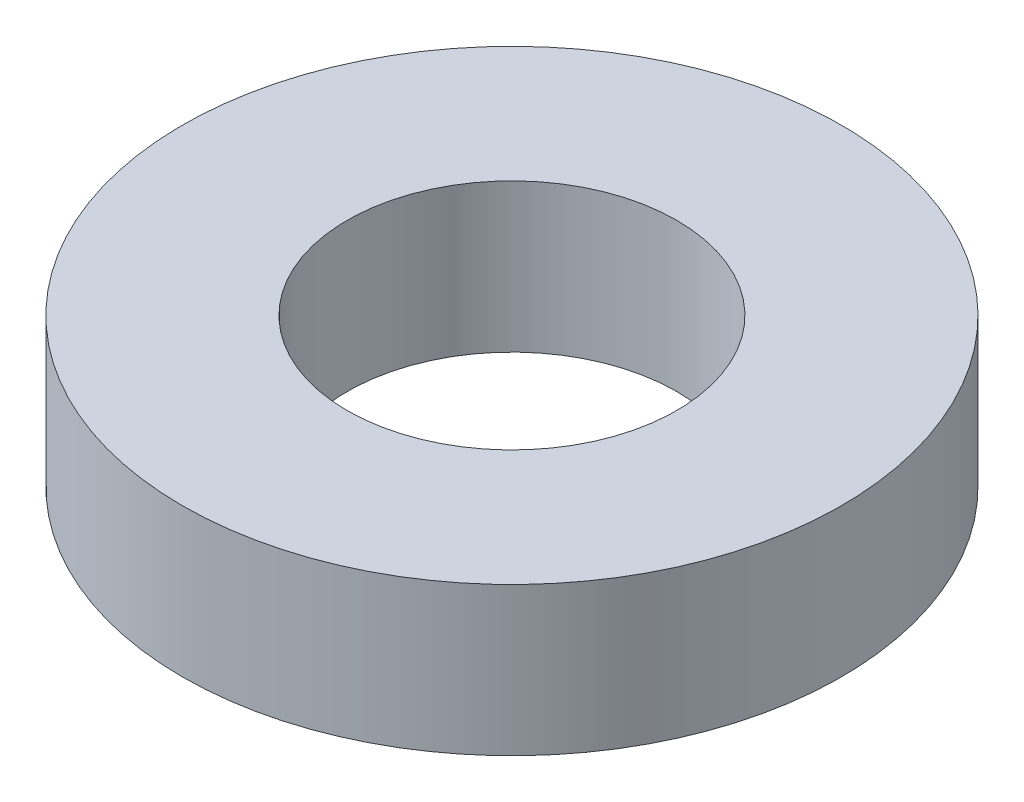
ISO-10303-21;
HEADER;
FILE_DESCRIPTION(('STEP AP214'),'2;1');
FILE_NAME('part.step','',(''),(''),'','','');
FILE_SCHEMA(('AUTOMOTIVE_DESIGN { 1 0 10303 214 1 1 1 1 }'));
ENDSEC;
DATA;
#1=APPLICATION_CONTEXT('core data for automotive mechanical design processes');
#2=APPLICATION_PROTOCOL_DEFINITION('international standard','automotive_design',2000,#1);
#3=PRODUCT_CONTEXT('',#1,'mechanical');
#4=PRODUCT('Part','Part','',(#3));
#5=PRODUCT_RELATED_PRODUCT_CATEGORY('part','',(#4));
#6=PRODUCT_DEFINITION_FORMATION('','',#4);
#7=PRODUCT_DEFINITION_CONTEXT('part definition',#1,'design');
#8=PRODUCT_DEFINITION('design','',#6,#7);
#9=PRODUCT_DEFINITION_SHAPE('','',#8);
#10=(LENGTH_UNIT() NAMED_UNIT(*) SI_UNIT(.MILLI.,.METRE.));
#11=(NAMED_UNIT(*) PLANE_ANGLE_UNIT() SI_UNIT($,.RADIAN.));
#12=(NAMED_UNIT(*) SI_UNIT($,.STERADIAN.) SOLID_ANGLE_UNIT());
#13=UNCERTAINTY_MEASURE_WITH_UNIT(LENGTH_MEASURE(1.E-05),#10,'distance_accuracy_value','');
#14=(GEOMETRIC_REPRESENTATION_CONTEXT(3) GLOBAL_UNCERTAINTY_ASSIGNED_CONTEXT((#13)) GLOBAL_UNIT_ASSIGNED_CONTEXT((#10,
#11,#12)) REPRESENTATION_CONTEXT('',''));
#15=CARTESIAN_POINT('',(0.,0.,0.));
#16=DIRECTION('',(0.,0.,1.));
#17=DIRECTION('',(1.,0.,0.));
#18=AXIS2_PLACEMENT_3D('',#15,#16,#17);
#19=CARTESIAN_POINT('',(0.,18.,0.));
#20=DIRECTION('',(0.,1.,0.));
#21=DIRECTION('',(0.,0.,1.));
#22=AXIS2_PLACEMENT_3D('',#19,#20,#21);
#23=PLANE('',#22);
#24=CARTESIAN_POINT('',(0.,18.,0.));
#25=DIRECTION('',(0.,1.,0.));
#26=DIRECTION('',(0.,0.,1.));
#27=AXIS2_PLACEMENT_3D('',#24,#25,#26);
#28=CIRCLE('',#27,40.);
#29=CARTESIAN_POINT('',(0.,18.,40.));
#30=VERTEX_POINT('',#29);
#31=EDGE_CURVE('E10',#30,#30,#28,.T.);
#32=ORIENTED_EDGE('',*,*,#31,.T.);
#33=EDGE_LOOP('',(#32));
#34=FACE_BOUND('',#33,.T.);
#35=CARTESIAN_POINT('',(0.,18.,0.));
#36=DIRECTION('',(0.,1.,0.));
#37=DIRECTION('',(0.,0.,1.));
#38=AXIS2_PLACEMENT_3D('',#35,#36,#37);
#39=CIRCLE('',#38,20.);
#40=CARTESIAN_POINT('',(0.,18.,20.));
#41=VERTEX_POINT('',#40);
#42=EDGE_CURVE('E42',#41,#41,#39,.T.);
#43=ORIENTED_EDGE('',*,*,#42,.F.);
#44=EDGE_LOOP('',(#43));
#45=FACE_BOUND('',#44,.T.);
#46=ADVANCED_FACE('F31',(#34,#45),#23,.T.);
#47=CARTESIAN_POINT('',(0.,0.,0.));
#48=DIRECTION('',(0.,1.,0.));
#49=DIRECTION('',(0.,0.,1.));
#50=AXIS2_PLACEMENT_3D('',#47,#48,#49);
#51=PLANE('',#50);
#52=CARTESIAN_POINT('',(0.,0.,0.));
#53=DIRECTION('',(0.,1.,0.));
#54=DIRECTION('',(0.,0.,1.));
#55=AXIS2_PLACEMENT_3D('',#52,#53,#54);
#56=CIRCLE('',#55,40.);
#57=CARTESIAN_POINT('',(0.,0.,40.));
#58=VERTEX_POINT('',#57);
#59=EDGE_CURVE('E35',#58,#58,#56,.T.);
#60=ORIENTED_EDGE('',*,*,#59,.F.);
#61=EDGE_LOOP('',(#60));
#62=FACE_BOUND('',#61,.T.);
#63=CARTESIAN_POINT('',(0.,0.,0.));
#64=DIRECTION('',(0.,1.,0.));
#65=DIRECTION('',(0.,0.,1.));
#66=AXIS2_PLACEMENT_3D('',#63,#64,#65);
#67=CIRCLE('',#66,20.);
#68=CARTESIAN_POINT('',(0.,0.,20.));
#69=VERTEX_POINT('',#68);
#70=EDGE_CURVE('E44',#69,#69,#67,.T.);
#71=ORIENTED_EDGE('',*,*,#70,.T.);
#72=EDGE_LOOP('',(#71));
#73=FACE_BOUND('',#72,.T.);
#74=ADVANCED_FACE('F54',(#62,#73),#51,.F.);
#75=CARTESIAN_POINT('',(0.,18.,0.));
#76=DIRECTION('',(0.,-1.,0.));
#77=DIRECTION('',(0.,0.,-1.));
#78=AXIS2_PLACEMENT_3D('',#75,#76,#77);
#79=CYLINDRICAL_SURFACE('',#78,40.);
#80=ORIENTED_EDGE('',*,*,#31,.F.);
#81=EDGE_LOOP('',(#80));
#82=FACE_BOUND('',#81,.T.);
#83=ORIENTED_EDGE('',*,*,#59,.T.);
#84=EDGE_LOOP('',(#83));
#85=FACE_BOUND('',#84,.T.);
#86=ADVANCED_FACE('F33',(#82,#85),#79,.T.);
#87=CARTESIAN_POINT('',(0.,18.,0.));
#88=DIRECTION('',(0.,-1.,0.));
#89=DIRECTION('',(0.,0.,-1.));
#90=AXIS2_PLACEMENT_3D('',#87,#88,#89);
#91=CYLINDRICAL_SURFACE('',#90,20.);
#92=ORIENTED_EDGE('',*,*,#42,.T.);
#93=EDGE_LOOP('',(#92));
#94=FACE_BOUND('',#93,.T.);
#95=ORIENTED_EDGE('',*,*,#70,.F.);
#96=EDGE_LOOP('',(#95));
#97=FACE_BOUND('',#96,.T.);
#98=ADVANCED_FACE('F50',(#94,#97),#91,.F.);
#99=CLOSED_SHELL('',(#46,#74,#86,#98));
#100=MANIFOLD_SOLID_BREP('B2',#99);
#101=ADVANCED_BREP_SHAPE_REPRESENTATION('',(#18,#100),#14);
#102=SHAPE_DEFINITION_REPRESENTATION(#9,#101);
ENDSEC;
END-ISO-10303-21;
